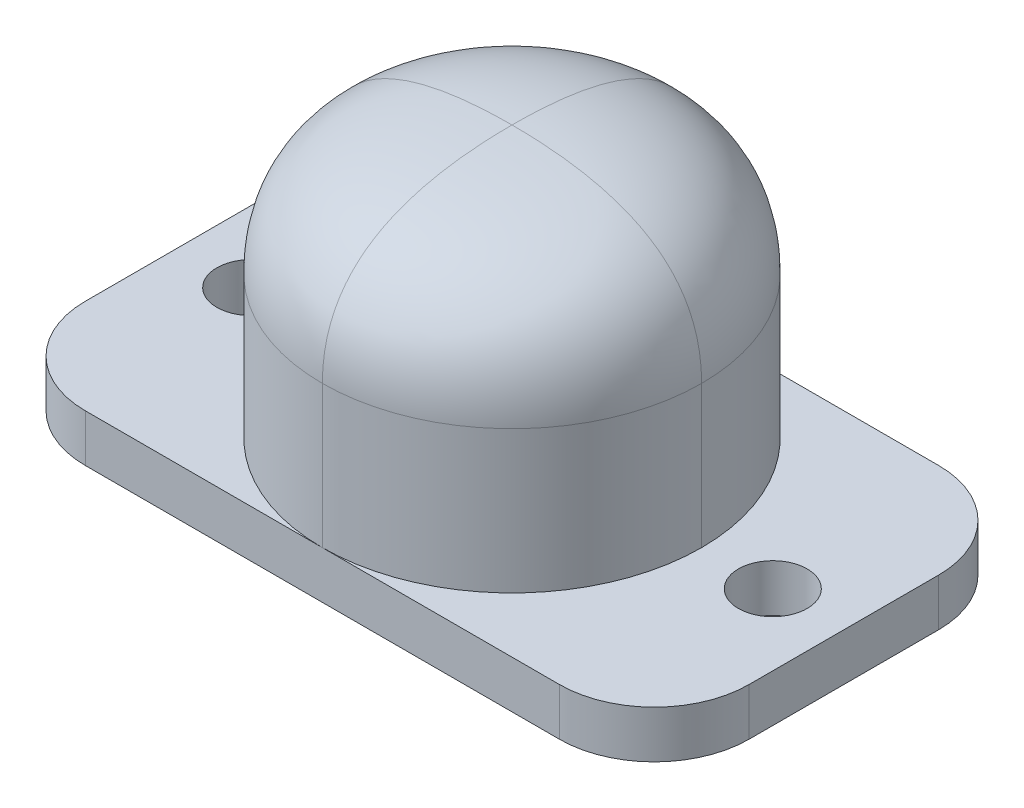
ISO-10303-21;
HEADER;
FILE_DESCRIPTION(('STEP AP214'),'2;1');
FILE_NAME('part.step','',(''),(''),'','','');
FILE_SCHEMA(('AUTOMOTIVE_DESIGN { 1 0 10303 214 1 1 1 1 }'));
ENDSEC;
DATA;
#1=APPLICATION_CONTEXT('core data for automotive mechanical design processes');
#2=APPLICATION_PROTOCOL_DEFINITION('international standard','automotive_design',2000,#1);
#3=PRODUCT_CONTEXT('',#1,'mechanical');
#4=PRODUCT('Part','Part','',(#3));
#5=PRODUCT_RELATED_PRODUCT_CATEGORY('part','',(#4));
#6=PRODUCT_DEFINITION_FORMATION('','',#4);
#7=PRODUCT_DEFINITION_CONTEXT('part definition',#1,'design');
#8=PRODUCT_DEFINITION('design','',#6,#7);
#9=PRODUCT_DEFINITION_SHAPE('','',#8);
#10=(LENGTH_UNIT() NAMED_UNIT(*) SI_UNIT(.MILLI.,.METRE.));
#11=(NAMED_UNIT(*) PLANE_ANGLE_UNIT() SI_UNIT($,.RADIAN.));
#12=(NAMED_UNIT(*) SI_UNIT($,.STERADIAN.) SOLID_ANGLE_UNIT());
#13=UNCERTAINTY_MEASURE_WITH_UNIT(LENGTH_MEASURE(1.E-05),#10,'distance_accuracy_value','');
#14=(GEOMETRIC_REPRESENTATION_CONTEXT(3) GLOBAL_UNCERTAINTY_ASSIGNED_CONTEXT((#13)) GLOBAL_UNIT_ASSIGNED_CONTEXT((#10,
#11,#12)) REPRESENTATION_CONTEXT('',''));
#15=CARTESIAN_POINT('',(0.,0.,0.));
#16=DIRECTION('',(0.,0.,1.));
#17=DIRECTION('',(1.,0.,0.));
#18=AXIS2_PLACEMENT_3D('',#15,#16,#17);
#19=CARTESIAN_POINT('',(44.45,0.,25.4));
#20=DIRECTION('',(0.,1.,0.));
#21=DIRECTION('',(0.,0.,1.));
#22=AXIS2_PLACEMENT_3D('',#19,#20,#21);
#23=PLANE('',#22);
#24=CARTESIAN_POINT('',(4.7625,0.,12.7));
#25=DIRECTION('',(0.,1.,0.));
#26=DIRECTION('',(0.,0.,1.));
#27=AXIS2_PLACEMENT_3D('',#24,#25,#26);
#28=CIRCLE('',#27,2.3);
#29=CARTESIAN_POINT('',(4.7625,0.,15.));
#30=VERTEX_POINT('',#29);
#31=EDGE_CURVE('E200',#30,#30,#28,.T.);
#32=ORIENTED_EDGE('',*,*,#31,.T.);
#33=EDGE_LOOP('',(#32));
#34=FACE_BOUND('',#33,.T.);
#35=CARTESIAN_POINT('',(39.6875,0.,12.7));
#36=DIRECTION('',(0.,1.,0.));
#37=DIRECTION('',(0.,0.,1.));
#38=AXIS2_PLACEMENT_3D('',#35,#36,#37);
#39=CIRCLE('',#38,2.3);
#40=CARTESIAN_POINT('',(39.6875,0.,15.));
#41=VERTEX_POINT('',#40);
#42=EDGE_CURVE('E213',#41,#41,#39,.T.);
#43=ORIENTED_EDGE('',*,*,#42,.T.);
#44=EDGE_LOOP('',(#43));
#45=FACE_BOUND('',#44,.T.);
#46=DIRECTION('',(0.,0.,-1.));
#47=VECTOR('',#46,1.);
#48=CARTESIAN_POINT('',(0.,0.,25.4));
#49=LINE('',#48,#47);
#50=CARTESIAN_POINT('',(0.,0.,19.05));
#51=VERTEX_POINT('',#50);
#52=CARTESIAN_POINT('',(0.,0.,6.35));
#53=VERTEX_POINT('',#52);
#54=EDGE_CURVE('E226',#51,#53,#49,.T.);
#55=ORIENTED_EDGE('',*,*,#54,.T.);
#56=CARTESIAN_POINT('',(6.35,0.,6.35));
#57=DIRECTION('',(0.,1.,0.));
#58=DIRECTION('',(0.,0.,1.));
#59=AXIS2_PLACEMENT_3D('',#56,#57,#58);
#60=CIRCLE('',#59,6.35);
#61=CARTESIAN_POINT('',(6.35,0.,0.));
#62=VERTEX_POINT('',#61);
#63=EDGE_CURVE('E255',#53,#62,#60,.F.);
#64=ORIENTED_EDGE('',*,*,#63,.T.);
#65=DIRECTION('',(1.,0.,0.));
#66=VECTOR('',#65,1.);
#67=CARTESIAN_POINT('',(44.45,0.,0.));
#68=LINE('',#67,#66);
#69=CARTESIAN_POINT('',(38.1,0.,0.));
#70=VERTEX_POINT('',#69);
#71=EDGE_CURVE('E206',#62,#70,#68,.T.);
#72=ORIENTED_EDGE('',*,*,#71,.T.);
#73=CARTESIAN_POINT('',(38.1,0.,6.35));
#74=DIRECTION('',(0.,1.,0.));
#75=DIRECTION('',(0.,0.,1.));
#76=AXIS2_PLACEMENT_3D('',#73,#74,#75);
#77=CIRCLE('',#76,6.35);
#78=CARTESIAN_POINT('',(44.45,0.,6.35));
#79=VERTEX_POINT('',#78);
#80=EDGE_CURVE('E251',#70,#79,#77,.F.);
#81=ORIENTED_EDGE('',*,*,#80,.T.);
#82=DIRECTION('',(0.,0.,-1.));
#83=VECTOR('',#82,1.);
#84=CARTESIAN_POINT('',(44.45,0.,25.4));
#85=LINE('',#84,#83);
#86=CARTESIAN_POINT('',(44.45,0.,19.05));
#87=VERTEX_POINT('',#86);
#88=EDGE_CURVE('E241',#87,#79,#85,.T.);
#89=ORIENTED_EDGE('',*,*,#88,.F.);
#90=CARTESIAN_POINT('',(38.1,0.,19.05));
#91=DIRECTION('',(0.,1.,0.));
#92=DIRECTION('',(0.,0.,1.));
#93=AXIS2_PLACEMENT_3D('',#90,#91,#92);
#94=CIRCLE('',#93,6.35);
#95=CARTESIAN_POINT('',(38.1,0.,25.4));
#96=VERTEX_POINT('',#95);
#97=EDGE_CURVE('E249',#87,#96,#94,.F.);
#98=ORIENTED_EDGE('',*,*,#97,.T.);
#99=DIRECTION('',(1.,0.,0.));
#100=VECTOR('',#99,1.);
#101=CARTESIAN_POINT('',(44.45,0.,25.4));
#102=LINE('',#101,#100);
#103=CARTESIAN_POINT('',(6.35,0.,25.4));
#104=VERTEX_POINT('',#103);
#105=EDGE_CURVE('E216',#104,#96,#102,.T.);
#106=ORIENTED_EDGE('',*,*,#105,.F.);
#107=CARTESIAN_POINT('',(6.35,0.,19.05));
#108=DIRECTION('',(0.,1.,0.));
#109=DIRECTION('',(0.,0.,1.));
#110=AXIS2_PLACEMENT_3D('',#107,#108,#109);
#111=CIRCLE('',#110,6.35);
#112=EDGE_CURVE('E253',#104,#51,#111,.F.);
#113=ORIENTED_EDGE('',*,*,#112,.T.);
#114=EDGE_LOOP('',(#55,#64,#72,#81,#89,#98,#106,#113));
#115=FACE_BOUND('',#114,.T.);
#116=ADVANCED_FACE('F37',(#34,#45,#115),#23,.F.);
#117=CARTESIAN_POINT('',(44.45,3.175,25.4));
#118=DIRECTION('',(-1.,0.,0.));
#119=DIRECTION('',(0.,0.,1.));
#120=AXIS2_PLACEMENT_3D('',#117,#118,#119);
#121=PLANE('',#120);
#122=ORIENTED_EDGE('',*,*,#88,.T.);
#123=DIRECTION('',(0.,1.,0.));
#124=VECTOR('',#123,1.);
#125=CARTESIAN_POINT('',(44.45,3.175,6.35));
#126=LINE('',#125,#124);
#127=CARTESIAN_POINT('',(44.45,3.175,6.35));
#128=VERTEX_POINT('',#127);
#129=EDGE_CURVE('E273',#79,#128,#126,.T.);
#130=ORIENTED_EDGE('',*,*,#129,.T.);
#131=DIRECTION('',(0.,0.,-1.));
#132=VECTOR('',#131,1.);
#133=CARTESIAN_POINT('',(44.45,3.175,25.4));
#134=LINE('',#133,#132);
#135=CARTESIAN_POINT('',(44.45,3.175,19.05));
#136=VERTEX_POINT('',#135);
#137=EDGE_CURVE('E238',#136,#128,#134,.T.);
#138=ORIENTED_EDGE('',*,*,#137,.F.);
#139=DIRECTION('',(0.,1.,0.));
#140=VECTOR('',#139,1.);
#141=CARTESIAN_POINT('',(44.45,3.175,19.05));
#142=LINE('',#141,#140);
#143=EDGE_CURVE('E271',#136,#87,#142,.F.);
#144=ORIENTED_EDGE('',*,*,#143,.T.);
#145=EDGE_LOOP('',(#122,#130,#138,#144));
#146=FACE_BOUND('',#145,.T.);
#147=ADVANCED_FACE('F292',(#146),#121,.F.);
#148=CARTESIAN_POINT('',(34.925,3.17499999999999,25.4));
#149=DIRECTION('',(0.,-1.,0.));
#150=DIRECTION('',(1.,0.,0.));
#151=AXIS2_PLACEMENT_3D('',#148,#149,#150);
#152=PLANE('',#151);
#153=CARTESIAN_POINT('',(39.6875,3.17499999999999,12.7));
#154=DIRECTION('',(0.,1.,0.));
#155=DIRECTION('',(0.,0.,1.));
#156=AXIS2_PLACEMENT_3D('',#153,#154,#155);
#157=CIRCLE('',#156,2.3);
#158=CARTESIAN_POINT('',(39.6875,3.17499999999999,15.));
#159=VERTEX_POINT('',#158);
#160=EDGE_CURVE('E210',#159,#159,#157,.T.);
#161=ORIENTED_EDGE('',*,*,#160,.F.);
#162=EDGE_LOOP('',(#161));
#163=FACE_BOUND('',#162,.T.);
#164=ORIENTED_EDGE('',*,*,#137,.T.);
#165=CARTESIAN_POINT('',(38.1,3.17499999999999,6.35));
#166=DIRECTION('',(0.,-1.,0.));
#167=DIRECTION('',(1.,0.,0.));
#168=AXIS2_PLACEMENT_3D('',#165,#166,#167);
#169=CIRCLE('',#168,6.35);
#170=CARTESIAN_POINT('',(38.1,3.17499999999999,0.));
#171=VERTEX_POINT('',#170);
#172=EDGE_CURVE('E144',#128,#171,#169,.F.);
#173=ORIENTED_EDGE('',*,*,#172,.T.);
#174=DIRECTION('',(-1.,0.,0.));
#175=VECTOR('',#174,1.);
#176=CARTESIAN_POINT('',(34.925,3.17499999999999,0.));
#177=LINE('',#176,#175);
#178=CARTESIAN_POINT('',(22.225,3.17499999999999,0.));
#179=VERTEX_POINT('',#178);
#180=EDGE_CURVE('E229',#171,#179,#177,.T.);
#181=ORIENTED_EDGE('',*,*,#180,.T.);
#182=CARTESIAN_POINT('',(22.225,3.17499999999999,12.7));
#183=DIRECTION('',(0.,-1.,0.));
#184=DIRECTION('',(1.,0.,0.));
#185=AXIS2_PLACEMENT_3D('',#182,#183,#184);
#186=CIRCLE('',#185,12.7);
#187=CARTESIAN_POINT('',(34.925,3.17499999999999,12.7));
#188=VERTEX_POINT('',#187);
#189=EDGE_CURVE('E60',#179,#188,#186,.T.);
#190=ORIENTED_EDGE('',*,*,#189,.T.);
#191=CARTESIAN_POINT('',(22.225,3.17499999999999,12.7));
#192=DIRECTION('',(0.,-1.,0.));
#193=DIRECTION('',(1.,0.,0.));
#194=AXIS2_PLACEMENT_3D('',#191,#192,#193);
#195=CIRCLE('',#194,12.7);
#196=CARTESIAN_POINT('',(22.225,3.17499999999999,25.4));
#197=VERTEX_POINT('',#196);
#198=EDGE_CURVE('E170',#188,#197,#195,.T.);
#199=ORIENTED_EDGE('',*,*,#198,.T.);
#200=DIRECTION('',(-1.,0.,0.));
#201=VECTOR('',#200,1.);
#202=CARTESIAN_POINT('',(34.925,3.17499999999999,25.4));
#203=LINE('',#202,#201);
#204=CARTESIAN_POINT('',(38.1,3.17499999999999,25.4));
#205=VERTEX_POINT('',#204);
#206=EDGE_CURVE('E219',#205,#197,#203,.T.);
#207=ORIENTED_EDGE('',*,*,#206,.F.);
#208=CARTESIAN_POINT('',(38.1,3.17499999999999,19.05));
#209=DIRECTION('',(0.,-1.,0.));
#210=DIRECTION('',(1.,0.,0.));
#211=AXIS2_PLACEMENT_3D('',#208,#209,#210);
#212=CIRCLE('',#211,6.35);
#213=EDGE_CURVE('E276',#205,#136,#212,.F.);
#214=ORIENTED_EDGE('',*,*,#213,.T.);
#215=EDGE_LOOP('',(#164,#173,#181,#190,#199,#207,#214));
#216=FACE_BOUND('',#215,.T.);
#217=ADVANCED_FACE('F278',(#163,#216),#152,.F.);
#218=CARTESIAN_POINT('',(0.,3.17499999999999,25.4));
#219=DIRECTION('',(0.,-1.,0.));
#220=DIRECTION('',(0.,0.,-1.));
#221=AXIS2_PLACEMENT_3D('',#218,#219,#220);
#222=PLANE('',#221);
#223=CARTESIAN_POINT('',(4.7625,3.17499999999999,12.7));
#224=DIRECTION('',(0.,1.,0.));
#225=DIRECTION('',(0.,0.,1.));
#226=AXIS2_PLACEMENT_3D('',#223,#224,#225);
#227=CIRCLE('',#226,2.3);
#228=CARTESIAN_POINT('',(4.7625,3.17499999999999,15.));
#229=VERTEX_POINT('',#228);
#230=EDGE_CURVE('E207',#229,#229,#227,.T.);
#231=ORIENTED_EDGE('',*,*,#230,.F.);
#232=EDGE_LOOP('',(#231));
#233=FACE_BOUND('',#232,.T.);
#234=DIRECTION('',(-1.,0.,0.));
#235=VECTOR('',#234,1.);
#236=CARTESIAN_POINT('',(0.,3.17499999999999,0.));
#237=LINE('',#236,#235);
#238=CARTESIAN_POINT('',(6.35,3.17499999999999,0.));
#239=VERTEX_POINT('',#238);
#240=EDGE_CURVE('E220',#179,#239,#237,.T.);
#241=ORIENTED_EDGE('',*,*,#240,.T.);
#242=CARTESIAN_POINT('',(6.35,3.17499999999999,6.35));
#243=DIRECTION('',(0.,-1.,0.));
#244=DIRECTION('',(0.,0.,-1.));
#245=AXIS2_PLACEMENT_3D('',#242,#243,#244);
#246=CIRCLE('',#245,6.35);
#247=CARTESIAN_POINT('',(0.,3.17499999999999,6.35));
#248=VERTEX_POINT('',#247);
#249=EDGE_CURVE('E263',#239,#248,#246,.F.);
#250=ORIENTED_EDGE('',*,*,#249,.T.);
#251=DIRECTION('',(0.,0.,-1.));
#252=VECTOR('',#251,1.);
#253=CARTESIAN_POINT('',(0.,3.17499999999999,25.4));
#254=LINE('',#253,#252);
#255=CARTESIAN_POINT('',(0.,3.17499999999999,19.05));
#256=VERTEX_POINT('',#255);
#257=EDGE_CURVE('E235',#256,#248,#254,.T.);
#258=ORIENTED_EDGE('',*,*,#257,.F.);
#259=CARTESIAN_POINT('',(6.35,3.17499999999999,19.05));
#260=DIRECTION('',(0.,-1.,0.));
#261=DIRECTION('',(0.,0.,-1.));
#262=AXIS2_PLACEMENT_3D('',#259,#260,#261);
#263=CIRCLE('',#262,6.35);
#264=CARTESIAN_POINT('',(6.35,3.17499999999999,25.4));
#265=VERTEX_POINT('',#264);
#266=EDGE_CURVE('E261',#256,#265,#263,.F.);
#267=ORIENTED_EDGE('',*,*,#266,.T.);
#268=DIRECTION('',(-1.,0.,0.));
#269=VECTOR('',#268,1.);
#270=CARTESIAN_POINT('',(0.,3.17499999999999,25.4));
#271=LINE('',#270,#269);
#272=EDGE_CURVE('E223',#197,#265,#271,.T.);
#273=ORIENTED_EDGE('',*,*,#272,.F.);
#274=CARTESIAN_POINT('',(22.225,3.17499999999999,12.7));
#275=DIRECTION('',(0.,-1.,0.));
#276=DIRECTION('',(0.,0.,-1.));
#277=AXIS2_PLACEMENT_3D('',#274,#275,#276);
#278=CIRCLE('',#277,12.7);
#279=CARTESIAN_POINT('',(9.525,3.17499999999999,12.7));
#280=VERTEX_POINT('',#279);
#281=EDGE_CURVE('E11',#197,#280,#278,.T.);
#282=ORIENTED_EDGE('',*,*,#281,.T.);
#283=CARTESIAN_POINT('',(22.225,3.17499999999999,12.7));
#284=DIRECTION('',(0.,-1.,0.));
#285=DIRECTION('',(0.,0.,-1.));
#286=AXIS2_PLACEMENT_3D('',#283,#284,#285);
#287=CIRCLE('',#286,12.7);
#288=EDGE_CURVE('E46',#280,#179,#287,.T.);
#289=ORIENTED_EDGE('',*,*,#288,.T.);
#290=EDGE_LOOP('',(#241,#250,#258,#267,#273,#282,#289));
#291=FACE_BOUND('',#290,.T.);
#292=ADVANCED_FACE('F315',(#233,#291),#222,.F.);
#293=CARTESIAN_POINT('',(0.,0.,25.4));
#294=DIRECTION('',(1.,0.,0.));
#295=DIRECTION('',(0.,0.,-1.));
#296=AXIS2_PLACEMENT_3D('',#293,#294,#295);
#297=PLANE('',#296);
#298=ORIENTED_EDGE('',*,*,#257,.T.);
#299=DIRECTION('',(0.,-1.,0.));
#300=VECTOR('',#299,1.);
#301=CARTESIAN_POINT('',(0.,0.,6.35));
#302=LINE('',#301,#300);
#303=EDGE_CURVE('E246',#248,#53,#302,.T.);
#304=ORIENTED_EDGE('',*,*,#303,.T.);
#305=ORIENTED_EDGE('',*,*,#54,.F.);
#306=DIRECTION('',(0.,-1.,0.));
#307=VECTOR('',#306,1.);
#308=CARTESIAN_POINT('',(0.,0.,19.05));
#309=LINE('',#308,#307);
#310=EDGE_CURVE('E244',#51,#256,#309,.F.);
#311=ORIENTED_EDGE('',*,*,#310,.T.);
#312=EDGE_LOOP('',(#298,#304,#305,#311));
#313=FACE_BOUND('',#312,.T.);
#314=ADVANCED_FACE('F308',(#313),#297,.F.);
#315=CARTESIAN_POINT('',(0.,0.,25.4));
#316=DIRECTION('',(0.,0.,-1.));
#317=DIRECTION('',(-1.,0.,0.));
#318=AXIS2_PLACEMENT_3D('',#315,#316,#317);
#319=PLANE('',#318);
#320=ORIENTED_EDGE('',*,*,#206,.T.);
#321=ORIENTED_EDGE('',*,*,#272,.T.);
#322=DIRECTION('',(0.,-1.,0.));
#323=VECTOR('',#322,1.);
#324=CARTESIAN_POINT('',(6.35,0.,25.4));
#325=LINE('',#324,#323);
#326=EDGE_CURVE('E268',#265,#104,#325,.T.);
#327=ORIENTED_EDGE('',*,*,#326,.T.);
#328=ORIENTED_EDGE('',*,*,#105,.T.);
#329=DIRECTION('',(0.,1.,0.));
#330=VECTOR('',#329,1.);
#331=CARTESIAN_POINT('',(38.1,0.,25.4));
#332=LINE('',#331,#330);
#333=EDGE_CURVE('E265',#96,#205,#332,.T.);
#334=ORIENTED_EDGE('',*,*,#333,.T.);
#335=EDGE_LOOP('',(#320,#321,#327,#328,#334));
#336=FACE_BOUND('',#335,.T.);
#337=ADVANCED_FACE('F299',(#336),#319,.F.);
#338=CARTESIAN_POINT('',(0.,0.,0.));
#339=DIRECTION('',(0.,0.,-1.));
#340=DIRECTION('',(-1.,0.,0.));
#341=AXIS2_PLACEMENT_3D('',#338,#339,#340);
#342=PLANE('',#341);
#343=ORIENTED_EDGE('',*,*,#240,.F.);
#344=ORIENTED_EDGE('',*,*,#180,.F.);
#345=DIRECTION('',(0.,1.,0.));
#346=VECTOR('',#345,1.);
#347=CARTESIAN_POINT('',(38.1,0.,0.));
#348=LINE('',#347,#346);
#349=EDGE_CURVE('E257',#171,#70,#348,.F.);
#350=ORIENTED_EDGE('',*,*,#349,.T.);
#351=ORIENTED_EDGE('',*,*,#71,.F.);
#352=DIRECTION('',(0.,-1.,0.));
#353=VECTOR('',#352,1.);
#354=CARTESIAN_POINT('',(6.35,3.17499999999999,0.));
#355=LINE('',#354,#353);
#356=EDGE_CURVE('E259',#62,#239,#355,.F.);
#357=ORIENTED_EDGE('',*,*,#356,.T.);
#358=EDGE_LOOP('',(#343,#344,#350,#351,#357));
#359=FACE_BOUND('',#358,.T.);
#360=ADVANCED_FACE('F284',(#359),#342,.T.);
#361=CARTESIAN_POINT('',(4.7625,0.,12.7));
#362=DIRECTION('',(0.,1.,0.));
#363=DIRECTION('',(0.,0.,1.));
#364=AXIS2_PLACEMENT_3D('',#361,#362,#363);
#365=CYLINDRICAL_SURFACE('',#364,2.3);
#366=ORIENTED_EDGE('',*,*,#31,.F.);
#367=EDGE_LOOP('',(#366));
#368=FACE_BOUND('',#367,.T.);
#369=ORIENTED_EDGE('',*,*,#230,.T.);
#370=EDGE_LOOP('',(#369));
#371=FACE_BOUND('',#370,.T.);
#372=ADVANCED_FACE('F379',(#368,#371),#365,.F.);
#373=CARTESIAN_POINT('',(39.6875,0.,12.7));
#374=DIRECTION('',(0.,1.,0.));
#375=DIRECTION('',(0.,0.,1.));
#376=AXIS2_PLACEMENT_3D('',#373,#374,#375);
#377=CYLINDRICAL_SURFACE('',#376,2.3);
#378=ORIENTED_EDGE('',*,*,#42,.F.);
#379=EDGE_LOOP('',(#378));
#380=FACE_BOUND('',#379,.T.);
#381=ORIENTED_EDGE('',*,*,#160,.T.);
#382=EDGE_LOOP('',(#381));
#383=FACE_BOUND('',#382,.T.);
#384=ADVANCED_FACE('F338',(#380,#383),#377,.F.);
#385=CARTESIAN_POINT('',(6.35,0.,6.35));
#386=DIRECTION('',(0.,1.,0.));
#387=DIRECTION('',(0.,0.,1.));
#388=AXIS2_PLACEMENT_3D('',#385,#386,#387);
#389=CYLINDRICAL_SURFACE('',#388,6.35);
#390=ORIENTED_EDGE('',*,*,#249,.F.);
#391=ORIENTED_EDGE('',*,*,#356,.F.);
#392=ORIENTED_EDGE('',*,*,#63,.F.);
#393=ORIENTED_EDGE('',*,*,#303,.F.);
#394=EDGE_LOOP('',(#390,#391,#392,#393));
#395=FACE_BOUND('',#394,.T.);
#396=ADVANCED_FACE('F313',(#395),#389,.T.);
#397=CARTESIAN_POINT('',(6.35,0.,19.05));
#398=DIRECTION('',(0.,-1.,0.));
#399=DIRECTION('',(0.,0.,-1.));
#400=AXIS2_PLACEMENT_3D('',#397,#398,#399);
#401=CYLINDRICAL_SURFACE('',#400,6.35);
#402=ORIENTED_EDGE('',*,*,#266,.F.);
#403=ORIENTED_EDGE('',*,*,#310,.F.);
#404=ORIENTED_EDGE('',*,*,#112,.F.);
#405=ORIENTED_EDGE('',*,*,#326,.F.);
#406=EDGE_LOOP('',(#402,#403,#404,#405));
#407=FACE_BOUND('',#406,.T.);
#408=ADVANCED_FACE('F304',(#407),#401,.T.);
#409=CARTESIAN_POINT('',(38.1,3.175,6.35));
#410=DIRECTION('',(0.,-1.,0.));
#411=DIRECTION('',(0.,0.,-1.));
#412=AXIS2_PLACEMENT_3D('',#409,#410,#411);
#413=CYLINDRICAL_SURFACE('',#412,6.35);
#414=ORIENTED_EDGE('',*,*,#80,.F.);
#415=ORIENTED_EDGE('',*,*,#349,.F.);
#416=ORIENTED_EDGE('',*,*,#172,.F.);
#417=ORIENTED_EDGE('',*,*,#129,.F.);
#418=EDGE_LOOP('',(#414,#415,#416,#417));
#419=FACE_BOUND('',#418,.T.);
#420=ADVANCED_FACE('F287',(#419),#413,.T.);
#421=CARTESIAN_POINT('',(38.1,0.,19.05));
#422=DIRECTION('',(0.,1.,0.));
#423=DIRECTION('',(0.,0.,1.));
#424=AXIS2_PLACEMENT_3D('',#421,#422,#423);
#425=CYLINDRICAL_SURFACE('',#424,6.35);
#426=ORIENTED_EDGE('',*,*,#97,.F.);
#427=ORIENTED_EDGE('',*,*,#143,.F.);
#428=ORIENTED_EDGE('',*,*,#213,.F.);
#429=ORIENTED_EDGE('',*,*,#333,.F.);
#430=EDGE_LOOP('',(#426,#427,#428,#429));
#431=FACE_BOUND('',#430,.T.);
#432=ADVANCED_FACE('F295',(#431),#425,.T.);
#433=CARTESIAN_POINT('',(22.225,3.17499999999999,12.7));
#434=DIRECTION('',(0.,1.,0.));
#435=DIRECTION('',(-1.,0.,0.));
#436=AXIS2_PLACEMENT_3D('',#433,#434,#435);
#437=CYLINDRICAL_SURFACE('',#436,12.7);
#438=DIRECTION('',(0.,-1.,0.));
#439=VECTOR('',#438,1.);
#440=CARTESIAN_POINT('',(9.525,3.17499999999999,12.7));
#441=LINE('',#440,#439);
#442=CARTESIAN_POINT('',(9.525,12.7,12.7));
#443=VERTEX_POINT('',#442);
#444=EDGE_CURVE('E135',#443,#280,#441,.T.);
#445=ORIENTED_EDGE('',*,*,#444,.F.);
#446=CARTESIAN_POINT('',(22.225,12.7,12.7));
#447=DIRECTION('',(0.,-1.,0.));
#448=DIRECTION('',(0.,0.,-1.));
#449=AXIS2_PLACEMENT_3D('',#446,#447,#448);
#450=CIRCLE('',#449,12.7);
#451=CARTESIAN_POINT('',(22.225,12.7,0.));
#452=VERTEX_POINT('',#451);
#453=EDGE_CURVE('E143',#452,#443,#450,.F.);
#454=ORIENTED_EDGE('',*,*,#453,.F.);
#455=DIRECTION('',(0.,-1.,0.));
#456=VECTOR('',#455,1.);
#457=CARTESIAN_POINT('',(22.225,12.7,0.));
#458=LINE('',#457,#456);
#459=EDGE_CURVE('E41',#179,#452,#458,.F.);
#460=ORIENTED_EDGE('',*,*,#459,.F.);
#461=ORIENTED_EDGE('',*,*,#288,.F.);
#462=EDGE_LOOP('',(#445,#454,#460,#461));
#463=FACE_BOUND('',#462,.T.);
#464=ADVANCED_FACE('F39',(#463),#437,.T.);
#465=CARTESIAN_POINT('',(22.225,12.7,12.7));
#466=DIRECTION('',(0.,-1.,0.));
#467=DIRECTION('',(0.,0.,-1.));
#468=AXIS2_PLACEMENT_3D('',#465,#466,#467);
#469=CYLINDRICAL_SURFACE('',#468,12.7);
#470=ORIENTED_EDGE('',*,*,#459,.T.);
#471=CARTESIAN_POINT('',(22.225,12.7,12.7));
#472=DIRECTION('',(0.,-1.,0.));
#473=DIRECTION('',(0.,0.,-1.));
#474=AXIS2_PLACEMENT_3D('',#471,#472,#473);
#475=CIRCLE('',#474,12.7);
#476=CARTESIAN_POINT('',(34.925,12.7,12.7));
#477=VERTEX_POINT('',#476);
#478=EDGE_CURVE('E161',#477,#452,#475,.F.);
#479=ORIENTED_EDGE('',*,*,#478,.F.);
#480=DIRECTION('',(0.,1.,0.));
#481=VECTOR('',#480,1.);
#482=CARTESIAN_POINT('',(34.925,12.7,12.7));
#483=LINE('',#482,#481);
#484=EDGE_CURVE('E150',#188,#477,#483,.T.);
#485=ORIENTED_EDGE('',*,*,#484,.F.);
#486=ORIENTED_EDGE('',*,*,#189,.F.);
#487=EDGE_LOOP('',(#470,#479,#485,#486));
#488=FACE_BOUND('',#487,.T.);
#489=ADVANCED_FACE('F180',(#488),#469,.T.);
#490=CARTESIAN_POINT('',(22.225,0.,12.7));
#491=DIRECTION('',(0.,-1.,0.));
#492=DIRECTION('',(1.,0.,0.));
#493=AXIS2_PLACEMENT_3D('',#490,#491,#492);
#494=CYLINDRICAL_SURFACE('',#493,12.7);
#495=ORIENTED_EDGE('',*,*,#444,.T.);
#496=ORIENTED_EDGE('',*,*,#281,.F.);
#497=DIRECTION('',(0.,-1.,0.));
#498=VECTOR('',#497,1.);
#499=CARTESIAN_POINT('',(22.225,0.,25.4));
#500=LINE('',#499,#498);
#501=CARTESIAN_POINT('',(22.225,12.7,25.4));
#502=VERTEX_POINT('',#501);
#503=EDGE_CURVE('E137',#502,#197,#500,.T.);
#504=ORIENTED_EDGE('',*,*,#503,.F.);
#505=CARTESIAN_POINT('',(22.225,12.7,12.7));
#506=DIRECTION('',(0.,-1.,0.));
#507=DIRECTION('',(0.,0.,-1.));
#508=AXIS2_PLACEMENT_3D('',#505,#506,#507);
#509=CIRCLE('',#508,12.7);
#510=EDGE_CURVE('E132',#443,#502,#509,.F.);
#511=ORIENTED_EDGE('',*,*,#510,.F.);
#512=EDGE_LOOP('',(#495,#496,#504,#511));
#513=FACE_BOUND('',#512,.T.);
#514=ADVANCED_FACE('F134',(#513),#494,.T.);
#515=CARTESIAN_POINT('',(22.225,0.,12.7));
#516=DIRECTION('',(0.,1.,0.));
#517=DIRECTION('',(0.,0.,1.));
#518=AXIS2_PLACEMENT_3D('',#515,#516,#517);
#519=CYLINDRICAL_SURFACE('',#518,12.7);
#520=ORIENTED_EDGE('',*,*,#198,.F.);
#521=ORIENTED_EDGE('',*,*,#484,.T.);
#522=CARTESIAN_POINT('',(22.225,12.7,12.7));
#523=DIRECTION('',(0.,-1.,0.));
#524=DIRECTION('',(0.,0.,-1.));
#525=AXIS2_PLACEMENT_3D('',#522,#523,#524);
#526=CIRCLE('',#525,12.7);
#527=EDGE_CURVE('E164',#502,#477,#526,.F.);
#528=ORIENTED_EDGE('',*,*,#527,.F.);
#529=ORIENTED_EDGE('',*,*,#503,.T.);
#530=EDGE_LOOP('',(#520,#521,#528,#529));
#531=FACE_BOUND('',#530,.T.);
#532=ADVANCED_FACE('F178',(#531),#519,.T.);
#533=CARTESIAN_POINT('',(9.525,12.7,12.7));
#534=CARTESIAN_POINT('',(9.525,21.336,12.7));
#535=CARTESIAN_POINT('',(22.225,21.336,12.7));
#536=CARTESIAN_POINT('',(9.525,12.7,20.1394877578617));
#537=CARTESIAN_POINT('',(9.525,21.336,20.1394877578617));
#538=CARTESIAN_POINT('',(22.225,21.336,12.7));
#539=CARTESIAN_POINT('',(14.7855122421383,12.7,25.4));
#540=CARTESIAN_POINT('',(14.7855122421383,21.336,25.4));
#541=CARTESIAN_POINT('',(22.225,21.336,12.7));
#542=CARTESIAN_POINT('',(22.225,12.7,25.4));
#543=CARTESIAN_POINT('',(22.225,21.336,25.4));
#544=CARTESIAN_POINT('',(22.225,21.336,12.7));
#545=(BOUNDED_SURFACE() B_SPLINE_SURFACE(3,2,((#533,#534,#535),(#536,#537,#538),(#539,#540,
#541),(#542,#543,#544)),.UNSPECIFIED.,.F.,.F.,.F.) B_SPLINE_SURFACE_WITH_KNOTS((4,4),(3,3),(0.,
1.),(0.,1.),.UNSPECIFIED.) GEOMETRIC_REPRESENTATION_ITEM() RATIONAL_B_SPLINE_SURFACE(((1.,1.,
1.),(0.804737854124365,0.804737854124365,0.804737854124365),(0.804737854124365,
0.804737854124365,0.804737854124365),(1.,1.,1.))) REPRESENTATION_ITEM('') SURFACE());
#546=CARTESIAN_POINT('',(22.225,12.7,25.4));
#547=CARTESIAN_POINT('',(22.225,21.336,25.4));
#548=CARTESIAN_POINT('',(22.225,21.336,12.7));
#549=(BOUNDED_CURVE() B_SPLINE_CURVE(2,(#546,#547,#548),.UNSPECIFIED.,.F.,
.F.) B_SPLINE_CURVE_WITH_KNOTS((3,3),(0.,1.),
.UNSPECIFIED.) CURVE() GEOMETRIC_REPRESENTATION_ITEM() RATIONAL_B_SPLINE_CURVE((1.,1.,1.)) REPRESENTATION_ITEM(''));
#550=CARTESIAN_POINT('',(22.225,21.336,12.7));
#551=VERTEX_POINT('',#550);
#552=EDGE_CURVE('E153',#502,#551,#549,.T.);
#553=CARTESIAN_POINT('',(9.525,12.7,12.7));
#554=CARTESIAN_POINT('',(9.525,21.336,12.7));
#555=CARTESIAN_POINT('',(22.225,21.336,12.7));
#556=(BOUNDED_CURVE() B_SPLINE_CURVE(2,(#553,#554,#555),.UNSPECIFIED.,.F.,
.F.) B_SPLINE_CURVE_WITH_KNOTS((3,3),(0.,1.),
.UNSPECIFIED.) CURVE() GEOMETRIC_REPRESENTATION_ITEM() RATIONAL_B_SPLINE_CURVE((1.,1.,1.)) REPRESENTATION_ITEM(''));
#557=EDGE_CURVE('E151',#551,#443,#556,.F.);
#558=ORIENTED_EDGE('',*,*,#510,.T.);
#559=ORIENTED_EDGE('',*,*,#552,.T.);
#560=ORIENTED_EDGE('',*,*,#557,.T.);
#561=EDGE_LOOP('',(#558,#559,#560));
#562=FACE_BOUND('',#561,.T.);
#563=ADVANCED_FACE('F152',(#562),#545,.T.);
#564=CARTESIAN_POINT('',(22.225,12.7,25.4));
#565=CARTESIAN_POINT('',(22.225,21.336,25.4));
#566=CARTESIAN_POINT('',(22.225,21.336,12.7));
#567=CARTESIAN_POINT('',(29.6644877578617,12.7,25.4));
#568=CARTESIAN_POINT('',(29.6644877578617,21.336,25.4));
#569=CARTESIAN_POINT('',(22.225,21.336,12.7));
#570=CARTESIAN_POINT('',(34.925,12.7,20.1394877578617));
#571=CARTESIAN_POINT('',(34.925,21.336,20.1394877578617));
#572=CARTESIAN_POINT('',(22.225,21.336,12.7));
#573=CARTESIAN_POINT('',(34.925,12.7,12.7));
#574=CARTESIAN_POINT('',(34.925,21.336,12.7));
#575=CARTESIAN_POINT('',(22.225,21.336,12.7));
#576=(BOUNDED_SURFACE() B_SPLINE_SURFACE(3,2,((#564,#565,#566),(#567,#568,#569),(#570,#571,
#572),(#573,#574,#575)),.UNSPECIFIED.,.F.,.F.,.F.) B_SPLINE_SURFACE_WITH_KNOTS((4,4),(3,3),(0.,
1.),(0.,1.),.UNSPECIFIED.) GEOMETRIC_REPRESENTATION_ITEM() RATIONAL_B_SPLINE_SURFACE(((1.,1.,
1.),(0.804737854124365,0.804737854124365,0.804737854124365),(0.804737854124365,
0.804737854124365,0.804737854124365),(1.,1.,1.))) REPRESENTATION_ITEM('') SURFACE());
#577=CARTESIAN_POINT('',(34.925,12.7,12.7));
#578=CARTESIAN_POINT('',(34.925,21.336,12.7));
#579=CARTESIAN_POINT('',(22.225,21.336,12.7));
#580=(BOUNDED_CURVE() B_SPLINE_CURVE(2,(#577,#578,#579),.UNSPECIFIED.,.F.,
.F.) B_SPLINE_CURVE_WITH_KNOTS((3,3),(0.,1.),
.UNSPECIFIED.) CURVE() GEOMETRIC_REPRESENTATION_ITEM() RATIONAL_B_SPLINE_CURVE((1.,1.,1.)) REPRESENTATION_ITEM(''));
#581=EDGE_CURVE('E185',#477,#551,#580,.T.);
#582=ORIENTED_EDGE('',*,*,#527,.T.);
#583=ORIENTED_EDGE('',*,*,#581,.T.);
#584=ORIENTED_EDGE('',*,*,#552,.F.);
#585=EDGE_LOOP('',(#582,#583,#584));
#586=FACE_BOUND('',#585,.T.);
#587=ADVANCED_FACE('F184',(#586),#576,.T.);
#588=CARTESIAN_POINT('',(22.225,12.7,0.));
#589=CARTESIAN_POINT('',(22.225,21.336,0.));
#590=CARTESIAN_POINT('',(22.225,21.336,12.7));
#591=CARTESIAN_POINT('',(14.7855122421383,12.7,0.));
#592=CARTESIAN_POINT('',(14.7855122421383,21.336,0.));
#593=CARTESIAN_POINT('',(22.225,21.336,12.7));
#594=CARTESIAN_POINT('',(9.525,12.7,5.26051224213831));
#595=CARTESIAN_POINT('',(9.525,21.336,5.26051224213831));
#596=CARTESIAN_POINT('',(22.225,21.336,12.7));
#597=CARTESIAN_POINT('',(9.525,12.7,12.7));
#598=CARTESIAN_POINT('',(9.525,21.336,12.7));
#599=CARTESIAN_POINT('',(22.225,21.336,12.7));
#600=(BOUNDED_SURFACE() B_SPLINE_SURFACE(3,2,((#588,#589,#590),(#591,#592,#593),(#594,#595,
#596),(#597,#598,#599)),.UNSPECIFIED.,.F.,.F.,.F.) B_SPLINE_SURFACE_WITH_KNOTS((4,4),(3,3),(0.,
1.),(0.,1.),.UNSPECIFIED.) GEOMETRIC_REPRESENTATION_ITEM() RATIONAL_B_SPLINE_SURFACE(((1.,1.,
1.),(0.804737854124365,0.804737854124365,0.804737854124365),(0.804737854124365,
0.804737854124365,0.804737854124365),(1.,1.,1.))) REPRESENTATION_ITEM('') SURFACE());
#601=CARTESIAN_POINT('',(22.225,12.7,0.));
#602=CARTESIAN_POINT('',(22.225,21.336,0.));
#603=CARTESIAN_POINT('',(22.225,21.336,12.7));
#604=(BOUNDED_CURVE() B_SPLINE_CURVE(2,(#601,#602,#603),.UNSPECIFIED.,.F.,
.F.) B_SPLINE_CURVE_WITH_KNOTS((3,3),(0.,1.),
.UNSPECIFIED.) CURVE() GEOMETRIC_REPRESENTATION_ITEM() RATIONAL_B_SPLINE_CURVE((1.,1.,1.)) REPRESENTATION_ITEM(''));
#605=EDGE_CURVE('E160',#452,#551,#604,.T.);
#606=ORIENTED_EDGE('',*,*,#453,.T.);
#607=ORIENTED_EDGE('',*,*,#557,.F.);
#608=ORIENTED_EDGE('',*,*,#605,.F.);
#609=EDGE_LOOP('',(#606,#607,#608));
#610=FACE_BOUND('',#609,.T.);
#611=ADVANCED_FACE('F158',(#610),#600,.T.);
#612=CARTESIAN_POINT('',(34.925,12.7,12.7));
#613=CARTESIAN_POINT('',(34.925,21.336,12.7));
#614=CARTESIAN_POINT('',(22.225,21.336,12.7));
#615=CARTESIAN_POINT('',(34.925,12.7,5.26051224213831));
#616=CARTESIAN_POINT('',(34.925,21.336,5.26051224213831));
#617=CARTESIAN_POINT('',(22.225,21.336,12.7));
#618=CARTESIAN_POINT('',(29.6644877578617,12.7,0.));
#619=CARTESIAN_POINT('',(29.6644877578617,21.336,0.));
#620=CARTESIAN_POINT('',(22.225,21.336,12.7));
#621=CARTESIAN_POINT('',(22.225,12.7,0.));
#622=CARTESIAN_POINT('',(22.225,21.336,0.));
#623=CARTESIAN_POINT('',(22.225,21.336,12.7));
#624=(BOUNDED_SURFACE() B_SPLINE_SURFACE(3,2,((#612,#613,#614),(#615,#616,#617),(#618,#619,
#620),(#621,#622,#623)),.UNSPECIFIED.,.F.,.F.,.F.) B_SPLINE_SURFACE_WITH_KNOTS((4,4),(3,3),(0.,
1.),(0.,1.),.UNSPECIFIED.) GEOMETRIC_REPRESENTATION_ITEM() RATIONAL_B_SPLINE_SURFACE(((1.,1.,
1.),(0.804737854124365,0.804737854124365,0.804737854124365),(0.804737854124365,
0.804737854124365,0.804737854124365),(1.,1.,1.))) REPRESENTATION_ITEM('') SURFACE());
#625=ORIENTED_EDGE('',*,*,#478,.T.);
#626=ORIENTED_EDGE('',*,*,#605,.T.);
#627=ORIENTED_EDGE('',*,*,#581,.F.);
#628=EDGE_LOOP('',(#625,#626,#627));
#629=FACE_BOUND('',#628,.T.);
#630=ADVANCED_FACE('F186',(#629),#624,.T.);
#631=CLOSED_SHELL('',(#116,#147,#217,#292,#314,#337,#360,#372,#384,#396,#408,#420,#432,#464,
#489,#514,#532,#563,#587,#611,#630));
#632=MANIFOLD_SOLID_BREP('B2',#631);
#633=ADVANCED_BREP_SHAPE_REPRESENTATION('',(#18,#632),#14);
#634=SHAPE_DEFINITION_REPRESENTATION(#9,#633);
ENDSEC;
END-ISO-10303-21;
